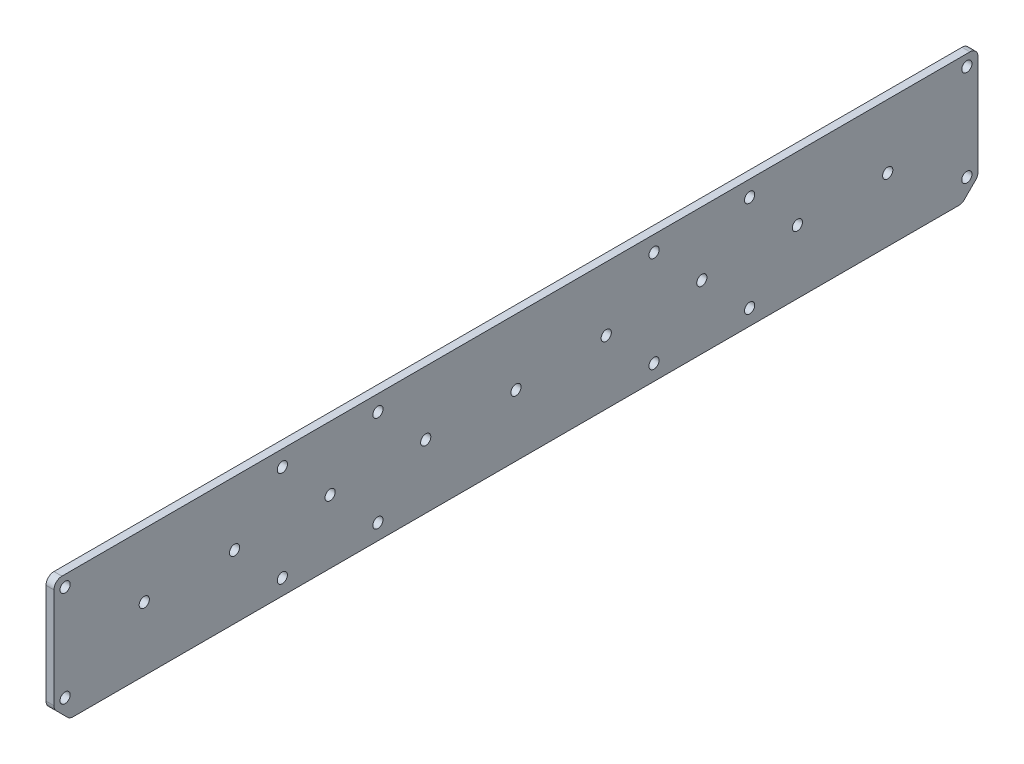
ISO-10303-21;
HEADER;
FILE_DESCRIPTION(('STEP AP214'),'2;1');
FILE_NAME('part.step','',(''),(''),'','','');
FILE_SCHEMA(('AUTOMOTIVE_DESIGN { 1 0 10303 214 1 1 1 1 }'));
ENDSEC;
DATA;
#1=APPLICATION_CONTEXT('core data for automotive mechanical design processes');
#2=APPLICATION_PROTOCOL_DEFINITION('international standard','automotive_design',2000,#1);
#3=PRODUCT_CONTEXT('',#1,'mechanical');
#4=PRODUCT('Part','Part','',(#3));
#5=PRODUCT_RELATED_PRODUCT_CATEGORY('part','',(#4));
#6=PRODUCT_DEFINITION_FORMATION('','',#4);
#7=PRODUCT_DEFINITION_CONTEXT('part definition',#1,'design');
#8=PRODUCT_DEFINITION('design','',#6,#7);
#9=PRODUCT_DEFINITION_SHAPE('','',#8);
#10=(LENGTH_UNIT() NAMED_UNIT(*) SI_UNIT(.MILLI.,.METRE.));
#11=(NAMED_UNIT(*) PLANE_ANGLE_UNIT() SI_UNIT($,.RADIAN.));
#12=(NAMED_UNIT(*) SI_UNIT($,.STERADIAN.) SOLID_ANGLE_UNIT());
#13=UNCERTAINTY_MEASURE_WITH_UNIT(LENGTH_MEASURE(1.E-05),#10,'distance_accuracy_value','');
#14=(GEOMETRIC_REPRESENTATION_CONTEXT(3) GLOBAL_UNCERTAINTY_ASSIGNED_CONTEXT((#13)) GLOBAL_UNIT_ASSIGNED_CONTEXT((#10,
#11,#12)) REPRESENTATION_CONTEXT('',''));
#15=CARTESIAN_POINT('',(0.,0.,0.));
#16=DIRECTION('',(0.,0.,1.));
#17=DIRECTION('',(1.,0.,0.));
#18=AXIS2_PLACEMENT_3D('',#15,#16,#17);
#19=CARTESIAN_POINT('',(3.175,0.,0.));
#20=DIRECTION('',(-1.,0.,0.));
#21=DIRECTION('',(0.,0.,1.));
#22=AXIS2_PLACEMENT_3D('',#19,#20,#21);
#23=PLANE('',#22);
#24=CARTESIAN_POINT('',(3.175,6.28396860616722,-91.0254223274925));
#25=DIRECTION('',(1.,0.,0.));
#26=DIRECTION('',(0.,0.,-1.));
#27=AXIS2_PLACEMENT_3D('',#24,#25,#26);
#28=CIRCLE('',#27,2.032);
#29=CARTESIAN_POINT('',(3.175,6.28396860616722,-93.0574223274924));
#30=VERTEX_POINT('',#29);
#31=EDGE_CURVE('E587',#30,#30,#28,.T.);
#32=ORIENTED_EDGE('',*,*,#31,.F.);
#33=EDGE_LOOP('',(#32));
#34=FACE_BOUND('',#33,.T.);
#35=CARTESIAN_POINT('',(3.175,44.5160313938328,-91.0254223274925));
#36=DIRECTION('',(1.,0.,0.));
#37=DIRECTION('',(0.,0.,-1.));
#38=AXIS2_PLACEMENT_3D('',#35,#36,#37);
#39=CIRCLE('',#38,2.032);
#40=CARTESIAN_POINT('',(3.175,44.5160313938328,-93.0574223274925));
#41=VERTEX_POINT('',#40);
#42=EDGE_CURVE('E590',#41,#41,#39,.T.);
#43=ORIENTED_EDGE('',*,*,#42,.F.);
#44=EDGE_LOOP('',(#43));
#45=FACE_BOUND('',#44,.T.);
#46=CARTESIAN_POINT('',(3.175,25.4,-71.9754223274925));
#47=DIRECTION('',(1.,0.,0.));
#48=DIRECTION('',(0.,0.,-1.));
#49=AXIS2_PLACEMENT_3D('',#46,#47,#48);
#50=CIRCLE('',#49,2.032);
#51=CARTESIAN_POINT('',(3.175,25.4,-74.0074223274925));
#52=VERTEX_POINT('',#51);
#53=EDGE_CURVE('E598',#52,#52,#50,.T.);
#54=ORIENTED_EDGE('',*,*,#53,.F.);
#55=EDGE_LOOP('',(#54));
#56=FACE_BOUND('',#55,.T.);
#57=CARTESIAN_POINT('',(3.175,25.4,-35.9920889941591));
#58=DIRECTION('',(1.,0.,0.));
#59=DIRECTION('',(0.,0.,-1.));
#60=AXIS2_PLACEMENT_3D('',#57,#58,#59);
#61=CIRCLE('',#60,2.032);
#62=CARTESIAN_POINT('',(3.175,25.4,-38.0240889941591));
#63=VERTEX_POINT('',#62);
#64=EDGE_CURVE('E605',#63,#63,#61,.T.);
#65=ORIENTED_EDGE('',*,*,#64,.F.);
#66=EDGE_LOOP('',(#65));
#67=FACE_BOUND('',#66,.T.);
#68=CARTESIAN_POINT('',(3.175,25.3999999999996,-148.175422327492));
#69=DIRECTION('',(1.,0.,0.));
#70=DIRECTION('',(0.,0.,-1.));
#71=AXIS2_PLACEMENT_3D('',#68,#69,#70);
#72=CIRCLE('',#71,2.032);
#73=CARTESIAN_POINT('',(3.175,25.3999999999996,-150.207422327492));
#74=VERTEX_POINT('',#73);
#75=EDGE_CURVE('E613',#74,#74,#72,.T.);
#76=ORIENTED_EDGE('',*,*,#75,.F.);
#77=EDGE_LOOP('',(#76));
#78=FACE_BOUND('',#77,.T.);
#79=CARTESIAN_POINT('',(3.175,6.28396860616722,-129.125422327492));
#80=DIRECTION('',(1.,0.,0.));
#81=DIRECTION('',(0.,0.,-1.));
#82=AXIS2_PLACEMENT_3D('',#79,#80,#81);
#83=CIRCLE('',#82,2.032);
#84=CARTESIAN_POINT('',(3.175,6.28396860616722,-131.157422327492));
#85=VERTEX_POINT('',#84);
#86=EDGE_CURVE('E621',#85,#85,#83,.T.);
#87=ORIENTED_EDGE('',*,*,#86,.F.);
#88=EDGE_LOOP('',(#87));
#89=FACE_BOUND('',#88,.T.);
#90=CARTESIAN_POINT('',(3.175,25.4,-110.075422327492));
#91=DIRECTION('',(1.,0.,0.));
#92=DIRECTION('',(0.,0.,-1.));
#93=AXIS2_PLACEMENT_3D('',#90,#91,#92);
#94=CIRCLE('',#93,2.032);
#95=CARTESIAN_POINT('',(3.175,25.4,-112.107422327492));
#96=VERTEX_POINT('',#95);
#97=EDGE_CURVE('E629',#96,#96,#94,.T.);
#98=ORIENTED_EDGE('',*,*,#97,.F.);
#99=EDGE_LOOP('',(#98));
#100=FACE_BOUND('',#99,.T.);
#101=CARTESIAN_POINT('',(3.175,44.5160313938328,-129.125422327492));
#102=DIRECTION('',(1.,0.,0.));
#103=DIRECTION('',(0.,0.,-1.));
#104=AXIS2_PLACEMENT_3D('',#101,#102,#103);
#105=CIRCLE('',#104,2.032);
#106=CARTESIAN_POINT('',(3.175,44.5160313938328,-131.157422327492));
#107=VERTEX_POINT('',#106);
#108=EDGE_CURVE('E637',#107,#107,#105,.T.);
#109=ORIENTED_EDGE('',*,*,#108,.F.);
#110=EDGE_LOOP('',(#109));
#111=FACE_BOUND('',#110,.T.);
#112=CARTESIAN_POINT('',(3.175,24.60625,-184.15));
#113=DIRECTION('',(1.,0.,0.));
#114=DIRECTION('',(0.,0.,-1.));
#115=AXIS2_PLACEMENT_3D('',#112,#113,#114);
#116=CIRCLE('',#115,2.032);
#117=CARTESIAN_POINT('',(3.175,24.60625,-186.182));
#118=VERTEX_POINT('',#117);
#119=EDGE_CURVE('E645',#118,#118,#116,.T.);
#120=ORIENTED_EDGE('',*,*,#119,.F.);
#121=EDGE_LOOP('',(#120));
#122=FACE_BOUND('',#121,.T.);
#123=CARTESIAN_POINT('',(3.175,25.4,-220.124577672508));
#124=DIRECTION('',(1.,0.,0.));
#125=DIRECTION('',(0.,0.,-1.));
#126=AXIS2_PLACEMENT_3D('',#123,#124,#125);
#127=CIRCLE('',#126,2.032);
#128=CARTESIAN_POINT('',(3.175,25.4,-222.156577672508));
#129=VERTEX_POINT('',#128);
#130=EDGE_CURVE('E653',#129,#129,#127,.T.);
#131=ORIENTED_EDGE('',*,*,#130,.F.);
#132=EDGE_LOOP('',(#131));
#133=FACE_BOUND('',#132,.T.);
#134=CARTESIAN_POINT('',(3.175,44.5160313938327,-239.174577672507));
#135=DIRECTION('',(1.,0.,0.));
#136=DIRECTION('',(0.,0.,-1.));
#137=AXIS2_PLACEMENT_3D('',#134,#135,#136);
#138=CIRCLE('',#137,2.032);
#139=CARTESIAN_POINT('',(3.175,44.5160313938327,-241.206577672508));
#140=VERTEX_POINT('',#139);
#141=EDGE_CURVE('E669',#140,#140,#138,.T.);
#142=ORIENTED_EDGE('',*,*,#141,.F.);
#143=EDGE_LOOP('',(#142));
#144=FACE_BOUND('',#143,.T.);
#145=CARTESIAN_POINT('',(3.175,25.4,-258.224577672508));
#146=DIRECTION('',(1.,0.,0.));
#147=DIRECTION('',(0.,0.,-1.));
#148=AXIS2_PLACEMENT_3D('',#145,#146,#147);
#149=CIRCLE('',#148,2.032);
#150=CARTESIAN_POINT('',(3.175,25.4,-260.256577672507));
#151=VERTEX_POINT('',#150);
#152=EDGE_CURVE('E677',#151,#151,#149,.T.);
#153=ORIENTED_EDGE('',*,*,#152,.F.);
#154=EDGE_LOOP('',(#153));
#155=FACE_BOUND('',#154,.T.);
#156=CARTESIAN_POINT('',(3.175,6.28396860616721,-277.274577672508));
#157=DIRECTION('',(1.,0.,0.));
#158=DIRECTION('',(0.,0.,-1.));
#159=AXIS2_PLACEMENT_3D('',#156,#157,#158);
#160=CIRCLE('',#159,2.032);
#161=CARTESIAN_POINT('',(3.175,6.28396860616721,-279.306577672508));
#162=VERTEX_POINT('',#161);
#163=EDGE_CURVE('E685',#162,#162,#160,.T.);
#164=ORIENTED_EDGE('',*,*,#163,.F.);
#165=EDGE_LOOP('',(#164));
#166=FACE_BOUND('',#165,.T.);
#167=CARTESIAN_POINT('',(3.175,44.5160313938327,-277.274577672508));
#168=DIRECTION('',(1.,0.,0.));
#169=DIRECTION('',(0.,0.,-1.));
#170=AXIS2_PLACEMENT_3D('',#167,#168,#169);
#171=CIRCLE('',#170,2.032);
#172=CARTESIAN_POINT('',(3.175,44.5160313938327,-279.306577672508));
#173=VERTEX_POINT('',#172);
#174=EDGE_CURVE('E693',#173,#173,#171,.T.);
#175=ORIENTED_EDGE('',*,*,#174,.F.);
#176=EDGE_LOOP('',(#175));
#177=FACE_BOUND('',#176,.T.);
#178=CARTESIAN_POINT('',(3.175,25.4,-296.324577672508));
#179=DIRECTION('',(1.,0.,0.));
#180=DIRECTION('',(0.,0.,-1.));
#181=AXIS2_PLACEMENT_3D('',#178,#179,#180);
#182=CIRCLE('',#181,2.032);
#183=CARTESIAN_POINT('',(3.175,25.4,-298.356577672508));
#184=VERTEX_POINT('',#183);
#185=EDGE_CURVE('E701',#184,#184,#182,.T.);
#186=ORIENTED_EDGE('',*,*,#185,.F.);
#187=EDGE_LOOP('',(#186));
#188=FACE_BOUND('',#187,.T.);
#189=CARTESIAN_POINT('',(3.175,25.4,-332.307911005841));
#190=DIRECTION('',(1.,0.,0.));
#191=DIRECTION('',(0.,0.,-1.));
#192=AXIS2_PLACEMENT_3D('',#189,#190,#191);
#193=CIRCLE('',#192,2.032);
#194=CARTESIAN_POINT('',(3.175,25.4,-334.339911005841));
#195=VERTEX_POINT('',#194);
#196=EDGE_CURVE('E709',#195,#195,#193,.T.);
#197=ORIENTED_EDGE('',*,*,#196,.F.);
#198=EDGE_LOOP('',(#197));
#199=FACE_BOUND('',#198,.T.);
#200=CARTESIAN_POINT('',(3.175,46.355,-363.855));
#201=DIRECTION('',(1.,0.,0.));
#202=DIRECTION('',(0.,0.,-1.));
#203=AXIS2_PLACEMENT_3D('',#200,#201,#202);
#204=CIRCLE('',#203,2.032);
#205=CARTESIAN_POINT('',(3.175,46.355,-365.887));
#206=VERTEX_POINT('',#205);
#207=EDGE_CURVE('E715',#206,#206,#204,.T.);
#208=ORIENTED_EDGE('',*,*,#207,.F.);
#209=EDGE_LOOP('',(#208));
#210=FACE_BOUND('',#209,.T.);
#211=CARTESIAN_POINT('',(3.175,46.355,-4.445));
#212=DIRECTION('',(1.,0.,0.));
#213=DIRECTION('',(0.,0.,-1.));
#214=AXIS2_PLACEMENT_3D('',#211,#212,#213);
#215=CIRCLE('',#214,2.032);
#216=CARTESIAN_POINT('',(3.175,46.355,-6.477));
#217=VERTEX_POINT('',#216);
#218=EDGE_CURVE('E721',#217,#217,#215,.T.);
#219=ORIENTED_EDGE('',*,*,#218,.F.);
#220=EDGE_LOOP('',(#219));
#221=FACE_BOUND('',#220,.T.);
#222=CARTESIAN_POINT('',(3.175,8.19117928474841,-4.445));
#223=DIRECTION('',(1.,0.,0.));
#224=DIRECTION('',(0.,0.,-1.));
#225=AXIS2_PLACEMENT_3D('',#222,#223,#224);
#226=CIRCLE('',#225,2.032);
#227=CARTESIAN_POINT('',(3.175,8.19117928474841,-6.477));
#228=VERTEX_POINT('',#227);
#229=EDGE_CURVE('E727',#228,#228,#226,.T.);
#230=ORIENTED_EDGE('',*,*,#229,.F.);
#231=EDGE_LOOP('',(#230));
#232=FACE_BOUND('',#231,.T.);
#233=CARTESIAN_POINT('',(3.175,8.1911792847484,-363.855));
#234=DIRECTION('',(1.,0.,0.));
#235=DIRECTION('',(0.,0.,-1.));
#236=AXIS2_PLACEMENT_3D('',#233,#234,#235);
#237=CIRCLE('',#236,2.032);
#238=CARTESIAN_POINT('',(3.175,8.1911792847484,-365.887));
#239=VERTEX_POINT('',#238);
#240=EDGE_CURVE('E734',#239,#239,#237,.T.);
#241=ORIENTED_EDGE('',*,*,#240,.F.);
#242=EDGE_LOOP('',(#241));
#243=FACE_BOUND('',#242,.T.);
#244=DIRECTION('',(0.,0.,-1.));
#245=VECTOR('',#244,1.);
#246=CARTESIAN_POINT('',(3.175,0.,0.));
#247=LINE('',#246,#245);
#248=CARTESIAN_POINT('',(3.175,0.,-7.66512806053454));
#249=VERTEX_POINT('',#248);
#250=CARTESIAN_POINT('',(3.175,0.,-360.634871939465));
#251=VERTEX_POINT('',#250);
#252=EDGE_CURVE('E164',#249,#251,#247,.T.);
#253=ORIENTED_EDGE('',*,*,#252,.T.);
#254=CARTESIAN_POINT('',(3.175,3.175,-360.634871939465));
#255=DIRECTION('',(-1.,0.,0.));
#256=DIRECTION('',(0.,0.,1.));
#257=AXIS2_PLACEMENT_3D('',#254,#255,#256);
#258=CIRCLE('',#257,3.175);
#259=CARTESIAN_POINT('',(3.175,0.929935969732726,-362.879935969733));
#260=VERTEX_POINT('',#259);
#261=EDGE_CURVE('E215',#251,#260,#258,.F.);
#262=ORIENTED_EDGE('',*,*,#261,.T.);
#263=DIRECTION('',(0.,-0.707106781186548,0.707106781186548));
#264=VECTOR('',#263,1.);
#265=CARTESIAN_POINT('',(3.175,6.34999999999997,-368.3));
#266=LINE('',#265,#264);
#267=CARTESIAN_POINT('',(3.175,5.42006403026729,-367.370064030267));
#268=VERTEX_POINT('',#267);
#269=EDGE_CURVE('E167',#260,#268,#266,.F.);
#270=ORIENTED_EDGE('',*,*,#269,.T.);
#271=CARTESIAN_POINT('',(3.175,7.66512806053458,-365.125));
#272=DIRECTION('',(-1.,0.,0.));
#273=DIRECTION('',(0.,0.,1.));
#274=AXIS2_PLACEMENT_3D('',#271,#272,#273);
#275=CIRCLE('',#274,3.175);
#276=CARTESIAN_POINT('',(3.175,7.66512806053458,-368.3));
#277=VERTEX_POINT('',#276);
#278=EDGE_CURVE('E213',#268,#277,#275,.F.);
#279=ORIENTED_EDGE('',*,*,#278,.T.);
#280=DIRECTION('',(0.,1.,0.));
#281=VECTOR('',#280,1.);
#282=CARTESIAN_POINT('',(3.175,0.,-368.3));
#283=LINE('',#282,#281);
#284=CARTESIAN_POINT('',(3.175,47.625,-368.3));
#285=VERTEX_POINT('',#284);
#286=EDGE_CURVE('E259',#277,#285,#283,.T.);
#287=ORIENTED_EDGE('',*,*,#286,.T.);
#288=CARTESIAN_POINT('',(3.175,47.625,-365.125));
#289=DIRECTION('',(-1.,0.,0.));
#290=DIRECTION('',(0.,0.,1.));
#291=AXIS2_PLACEMENT_3D('',#288,#289,#290);
#292=CIRCLE('',#291,3.175);
#293=CARTESIAN_POINT('',(3.175,50.8,-365.125));
#294=VERTEX_POINT('',#293);
#295=EDGE_CURVE('E211',#285,#294,#292,.F.);
#296=ORIENTED_EDGE('',*,*,#295,.T.);
#297=DIRECTION('',(0.,0.,1.));
#298=VECTOR('',#297,1.);
#299=CARTESIAN_POINT('',(3.175,50.8,0.));
#300=LINE('',#299,#298);
#301=CARTESIAN_POINT('',(3.175,50.8,-3.175));
#302=VERTEX_POINT('',#301);
#303=EDGE_CURVE('E194',#294,#302,#300,.T.);
#304=ORIENTED_EDGE('',*,*,#303,.T.);
#305=CARTESIAN_POINT('',(3.175,47.625,-3.175));
#306=DIRECTION('',(-1.,0.,0.));
#307=DIRECTION('',(0.,0.,1.));
#308=AXIS2_PLACEMENT_3D('',#305,#306,#307);
#309=CIRCLE('',#308,3.175);
#310=CARTESIAN_POINT('',(3.175,47.625,0.));
#311=VERTEX_POINT('',#310);
#312=EDGE_CURVE('E203',#302,#311,#309,.F.);
#313=ORIENTED_EDGE('',*,*,#312,.T.);
#314=DIRECTION('',(0.,-1.,0.));
#315=VECTOR('',#314,1.);
#316=CARTESIAN_POINT('',(3.175,0.,0.));
#317=LINE('',#316,#315);
#318=CARTESIAN_POINT('',(3.175,7.66512806053454,0.));
#319=VERTEX_POINT('',#318);
#320=EDGE_CURVE('E189',#311,#319,#317,.T.);
#321=ORIENTED_EDGE('',*,*,#320,.T.);
#322=CARTESIAN_POINT('',(3.175,7.66512806053454,-3.175));
#323=DIRECTION('',(-1.,0.,0.));
#324=DIRECTION('',(0.,0.,1.));
#325=AXIS2_PLACEMENT_3D('',#322,#323,#324);
#326=CIRCLE('',#325,3.175);
#327=CARTESIAN_POINT('',(3.175,5.42006403026726,-0.92993596973271));
#328=VERTEX_POINT('',#327);
#329=EDGE_CURVE('E205',#319,#328,#326,.F.);
#330=ORIENTED_EDGE('',*,*,#329,.T.);
#331=DIRECTION('',(0.,0.707106781186548,0.707106781186548));
#332=VECTOR('',#331,1.);
#333=CARTESIAN_POINT('',(3.175,0.,-6.34999999999997));
#334=LINE('',#333,#332);
#335=CARTESIAN_POINT('',(3.175,0.929935969732711,-5.42006403026726));
#336=VERTEX_POINT('',#335);
#337=EDGE_CURVE('E196',#328,#336,#334,.F.);
#338=ORIENTED_EDGE('',*,*,#337,.T.);
#339=CARTESIAN_POINT('',(3.175,3.175,-7.66512806053454));
#340=DIRECTION('',(-1.,0.,0.));
#341=DIRECTION('',(0.,0.,1.));
#342=AXIS2_PLACEMENT_3D('',#339,#340,#341);
#343=CIRCLE('',#342,3.175);
#344=EDGE_CURVE('E208',#336,#249,#343,.F.);
#345=ORIENTED_EDGE('',*,*,#344,.T.);
#346=EDGE_LOOP('',(#253,#262,#270,#279,#287,#296,#304,#313,#321,#330,#338,#345));
#347=FACE_BOUND('',#346,.T.);
#348=CARTESIAN_POINT('',(3.175,6.28396860616721,-239.174577672507));
#349=DIRECTION('',(1.,0.,0.));
#350=DIRECTION('',(0.,0.,-1.));
#351=AXIS2_PLACEMENT_3D('',#348,#349,#350);
#352=CIRCLE('',#351,2.032);
#353=CARTESIAN_POINT('',(3.175,6.28396860616721,-241.206577672508));
#354=VERTEX_POINT('',#353);
#355=EDGE_CURVE('E661',#354,#354,#352,.T.);
#356=ORIENTED_EDGE('',*,*,#355,.F.);
#357=EDGE_LOOP('',(#356));
#358=FACE_BOUND('',#357,.T.);
#359=ADVANCED_FACE('F47',(#34,#45,#56,#67,#78,#89,#100,#111,#122,#133,#144,#155,#166,#177,#188,
#199,#210,#221,#232,#243,#347,#358),#23,.F.);
#360=CARTESIAN_POINT('',(3.175,0.,0.));
#361=DIRECTION('',(0.,0.,-1.));
#362=DIRECTION('',(-1.,0.,0.));
#363=AXIS2_PLACEMENT_3D('',#360,#361,#362);
#364=PLANE('',#363);
#365=DIRECTION('',(0.,-1.,0.));
#366=VECTOR('',#365,1.);
#367=CARTESIAN_POINT('',(0.,0.,0.));
#368=LINE('',#367,#366);
#369=CARTESIAN_POINT('',(0.,47.625,0.));
#370=VERTEX_POINT('',#369);
#371=CARTESIAN_POINT('',(0.,7.66512806053454,0.));
#372=VERTEX_POINT('',#371);
#373=EDGE_CURVE('E175',#370,#372,#368,.T.);
#374=ORIENTED_EDGE('',*,*,#373,.T.);
#375=DIRECTION('',(-1.,0.,0.));
#376=VECTOR('',#375,1.);
#377=CARTESIAN_POINT('',(3.175,7.66512806053454,0.));
#378=LINE('',#377,#376);
#379=EDGE_CURVE('E11',#372,#319,#378,.F.);
#380=ORIENTED_EDGE('',*,*,#379,.T.);
#381=ORIENTED_EDGE('',*,*,#320,.F.);
#382=DIRECTION('',(-1.,0.,0.));
#383=VECTOR('',#382,1.);
#384=CARTESIAN_POINT('',(3.175,47.625,0.));
#385=LINE('',#384,#383);
#386=EDGE_CURVE('E55',#311,#370,#385,.T.);
#387=ORIENTED_EDGE('',*,*,#386,.T.);
#388=EDGE_LOOP('',(#374,#380,#381,#387));
#389=FACE_BOUND('',#388,.T.);
#390=ADVANCED_FACE('F245',(#389),#364,.F.);
#391=CARTESIAN_POINT('',(3.175,0.,0.));
#392=DIRECTION('',(0.,1.,0.));
#393=DIRECTION('',(0.,0.,1.));
#394=AXIS2_PLACEMENT_3D('',#391,#392,#393);
#395=PLANE('',#394);
#396=DIRECTION('',(0.,0.,-1.));
#397=VECTOR('',#396,1.);
#398=CARTESIAN_POINT('',(0.,0.,0.));
#399=LINE('',#398,#397);
#400=CARTESIAN_POINT('',(0.,0.,-7.66512806053454));
#401=VERTEX_POINT('',#400);
#402=CARTESIAN_POINT('',(0.,0.,-360.634871939465));
#403=VERTEX_POINT('',#402);
#404=EDGE_CURVE('E161',#401,#403,#399,.T.);
#405=ORIENTED_EDGE('',*,*,#404,.T.);
#406=DIRECTION('',(-1.,0.,0.));
#407=VECTOR('',#406,1.);
#408=CARTESIAN_POINT('',(3.175,0.,-360.634871939465));
#409=LINE('',#408,#407);
#410=EDGE_CURVE('E166',#403,#251,#409,.F.);
#411=ORIENTED_EDGE('',*,*,#410,.T.);
#412=ORIENTED_EDGE('',*,*,#252,.F.);
#413=DIRECTION('',(1.,0.,0.));
#414=VECTOR('',#413,1.);
#415=CARTESIAN_POINT('',(0.,0.,-7.66512806053454));
#416=LINE('',#415,#414);
#417=EDGE_CURVE('E148',#249,#401,#416,.F.);
#418=ORIENTED_EDGE('',*,*,#417,.T.);
#419=EDGE_LOOP('',(#405,#411,#412,#418));
#420=FACE_BOUND('',#419,.T.);
#421=ADVANCED_FACE('F159',(#420),#395,.F.);
#422=CARTESIAN_POINT('',(3.175,0.,-368.3));
#423=DIRECTION('',(0.,0.,1.));
#424=DIRECTION('',(1.,0.,0.));
#425=AXIS2_PLACEMENT_3D('',#422,#423,#424);
#426=PLANE('',#425);
#427=ORIENTED_EDGE('',*,*,#286,.F.);
#428=DIRECTION('',(1.,0.,0.));
#429=VECTOR('',#428,1.);
#430=CARTESIAN_POINT('',(0.,7.66512806053458,-368.3));
#431=LINE('',#430,#429);
#432=CARTESIAN_POINT('',(0.,7.66512806053458,-368.3));
#433=VERTEX_POINT('',#432);
#434=EDGE_CURVE('E230',#277,#433,#431,.F.);
#435=ORIENTED_EDGE('',*,*,#434,.T.);
#436=DIRECTION('',(0.,1.,0.));
#437=VECTOR('',#436,1.);
#438=CARTESIAN_POINT('',(0.,0.,-368.3));
#439=LINE('',#438,#437);
#440=CARTESIAN_POINT('',(0.,47.625,-368.3));
#441=VERTEX_POINT('',#440);
#442=EDGE_CURVE('E174',#433,#441,#439,.T.);
#443=ORIENTED_EDGE('',*,*,#442,.T.);
#444=DIRECTION('',(-1.,0.,0.));
#445=VECTOR('',#444,1.);
#446=CARTESIAN_POINT('',(3.175,47.625,-368.3));
#447=LINE('',#446,#445);
#448=EDGE_CURVE('E228',#441,#285,#447,.F.);
#449=ORIENTED_EDGE('',*,*,#448,.T.);
#450=EDGE_LOOP('',(#427,#435,#443,#449));
#451=FACE_BOUND('',#450,.T.);
#452=ADVANCED_FACE('F274',(#451),#426,.F.);
#453=CARTESIAN_POINT('',(3.175,50.8,0.));
#454=DIRECTION('',(0.,-1.,0.));
#455=DIRECTION('',(0.,0.,-1.));
#456=AXIS2_PLACEMENT_3D('',#453,#454,#455);
#457=PLANE('',#456);
#458=ORIENTED_EDGE('',*,*,#303,.F.);
#459=DIRECTION('',(-1.,0.,0.));
#460=VECTOR('',#459,1.);
#461=CARTESIAN_POINT('',(3.175,50.8,-365.125));
#462=LINE('',#461,#460);
#463=CARTESIAN_POINT('',(0.,50.8,-365.125));
#464=VERTEX_POINT('',#463);
#465=EDGE_CURVE('E235',#294,#464,#462,.T.);
#466=ORIENTED_EDGE('',*,*,#465,.T.);
#467=DIRECTION('',(0.,0.,1.));
#468=VECTOR('',#467,1.);
#469=CARTESIAN_POINT('',(0.,50.8,0.));
#470=LINE('',#469,#468);
#471=CARTESIAN_POINT('',(0.,50.8,-3.175));
#472=VERTEX_POINT('',#471);
#473=EDGE_CURVE('E180',#464,#472,#470,.T.);
#474=ORIENTED_EDGE('',*,*,#473,.T.);
#475=DIRECTION('',(-1.,0.,0.));
#476=VECTOR('',#475,1.);
#477=CARTESIAN_POINT('',(3.175,50.8,-3.175));
#478=LINE('',#477,#476);
#479=EDGE_CURVE('E233',#472,#302,#478,.F.);
#480=ORIENTED_EDGE('',*,*,#479,.T.);
#481=EDGE_LOOP('',(#458,#466,#474,#480));
#482=FACE_BOUND('',#481,.T.);
#483=ADVANCED_FACE('F270',(#482),#457,.F.);
#484=CARTESIAN_POINT('',(0.,0.,0.));
#485=DIRECTION('',(-1.,0.,0.));
#486=DIRECTION('',(0.,0.,1.));
#487=AXIS2_PLACEMENT_3D('',#484,#485,#486);
#488=PLANE('',#487);
#489=CARTESIAN_POINT('',(0.,6.28396860616722,-91.0254223274925));
#490=DIRECTION('',(1.,0.,0.));
#491=DIRECTION('',(0.,0.,-1.));
#492=AXIS2_PLACEMENT_3D('',#489,#490,#491);
#493=CIRCLE('',#492,2.032);
#494=CARTESIAN_POINT('',(0.,6.28396860616722,-93.0574223274924));
#495=VERTEX_POINT('',#494);
#496=EDGE_CURVE('E585',#495,#495,#493,.T.);
#497=ORIENTED_EDGE('',*,*,#496,.T.);
#498=EDGE_LOOP('',(#497));
#499=FACE_BOUND('',#498,.T.);
#500=CARTESIAN_POINT('',(0.,44.5160313938328,-91.0254223274925));
#501=DIRECTION('',(1.,0.,0.));
#502=DIRECTION('',(0.,0.,-1.));
#503=AXIS2_PLACEMENT_3D('',#500,#501,#502);
#504=CIRCLE('',#503,2.032);
#505=CARTESIAN_POINT('',(0.,44.5160313938328,-93.0574223274925));
#506=VERTEX_POINT('',#505);
#507=EDGE_CURVE('E595',#506,#506,#504,.T.);
#508=ORIENTED_EDGE('',*,*,#507,.T.);
#509=EDGE_LOOP('',(#508));
#510=FACE_BOUND('',#509,.T.);
#511=CARTESIAN_POINT('',(0.,25.4,-71.9754223274925));
#512=DIRECTION('',(1.,0.,0.));
#513=DIRECTION('',(0.,0.,-1.));
#514=AXIS2_PLACEMENT_3D('',#511,#512,#513);
#515=CIRCLE('',#514,2.032);
#516=CARTESIAN_POINT('',(0.,25.4,-74.0074223274925));
#517=VERTEX_POINT('',#516);
#518=EDGE_CURVE('E601',#517,#517,#515,.T.);
#519=ORIENTED_EDGE('',*,*,#518,.T.);
#520=EDGE_LOOP('',(#519));
#521=FACE_BOUND('',#520,.T.);
#522=CARTESIAN_POINT('',(0.,25.4,-35.9920889941591));
#523=DIRECTION('',(1.,0.,0.));
#524=DIRECTION('',(0.,0.,-1.));
#525=AXIS2_PLACEMENT_3D('',#522,#523,#524);
#526=CIRCLE('',#525,2.032);
#527=CARTESIAN_POINT('',(0.,25.4,-38.0240889941591));
#528=VERTEX_POINT('',#527);
#529=EDGE_CURVE('E609',#528,#528,#526,.T.);
#530=ORIENTED_EDGE('',*,*,#529,.T.);
#531=EDGE_LOOP('',(#530));
#532=FACE_BOUND('',#531,.T.);
#533=CARTESIAN_POINT('',(0.,25.3999999999996,-148.175422327492));
#534=DIRECTION('',(1.,0.,0.));
#535=DIRECTION('',(0.,0.,-1.));
#536=AXIS2_PLACEMENT_3D('',#533,#534,#535);
#537=CIRCLE('',#536,2.032);
#538=CARTESIAN_POINT('',(0.,25.3999999999996,-150.207422327492));
#539=VERTEX_POINT('',#538);
#540=EDGE_CURVE('E617',#539,#539,#537,.T.);
#541=ORIENTED_EDGE('',*,*,#540,.T.);
#542=EDGE_LOOP('',(#541));
#543=FACE_BOUND('',#542,.T.);
#544=CARTESIAN_POINT('',(0.,6.28396860616722,-129.125422327492));
#545=DIRECTION('',(1.,0.,0.));
#546=DIRECTION('',(0.,0.,-1.));
#547=AXIS2_PLACEMENT_3D('',#544,#545,#546);
#548=CIRCLE('',#547,2.032);
#549=CARTESIAN_POINT('',(0.,6.28396860616722,-131.157422327492));
#550=VERTEX_POINT('',#549);
#551=EDGE_CURVE('E625',#550,#550,#548,.T.);
#552=ORIENTED_EDGE('',*,*,#551,.T.);
#553=EDGE_LOOP('',(#552));
#554=FACE_BOUND('',#553,.T.);
#555=CARTESIAN_POINT('',(0.,25.4,-110.075422327492));
#556=DIRECTION('',(1.,0.,0.));
#557=DIRECTION('',(0.,0.,-1.));
#558=AXIS2_PLACEMENT_3D('',#555,#556,#557);
#559=CIRCLE('',#558,2.032);
#560=CARTESIAN_POINT('',(0.,25.4,-112.107422327492));
#561=VERTEX_POINT('',#560);
#562=EDGE_CURVE('E633',#561,#561,#559,.T.);
#563=ORIENTED_EDGE('',*,*,#562,.T.);
#564=EDGE_LOOP('',(#563));
#565=FACE_BOUND('',#564,.T.);
#566=CARTESIAN_POINT('',(0.,44.5160313938328,-129.125422327492));
#567=DIRECTION('',(1.,0.,0.));
#568=DIRECTION('',(0.,0.,-1.));
#569=AXIS2_PLACEMENT_3D('',#566,#567,#568);
#570=CIRCLE('',#569,2.032);
#571=CARTESIAN_POINT('',(0.,44.5160313938328,-131.157422327492));
#572=VERTEX_POINT('',#571);
#573=EDGE_CURVE('E641',#572,#572,#570,.T.);
#574=ORIENTED_EDGE('',*,*,#573,.T.);
#575=EDGE_LOOP('',(#574));
#576=FACE_BOUND('',#575,.T.);
#577=CARTESIAN_POINT('',(0.,24.60625,-184.15));
#578=DIRECTION('',(1.,0.,0.));
#579=DIRECTION('',(0.,0.,-1.));
#580=AXIS2_PLACEMENT_3D('',#577,#578,#579);
#581=CIRCLE('',#580,2.032);
#582=CARTESIAN_POINT('',(0.,24.60625,-186.182));
#583=VERTEX_POINT('',#582);
#584=EDGE_CURVE('E649',#583,#583,#581,.T.);
#585=ORIENTED_EDGE('',*,*,#584,.T.);
#586=EDGE_LOOP('',(#585));
#587=FACE_BOUND('',#586,.T.);
#588=CARTESIAN_POINT('',(0.,25.4,-220.124577672508));
#589=DIRECTION('',(1.,0.,0.));
#590=DIRECTION('',(0.,0.,-1.));
#591=AXIS2_PLACEMENT_3D('',#588,#589,#590);
#592=CIRCLE('',#591,2.032);
#593=CARTESIAN_POINT('',(0.,25.4,-222.156577672508));
#594=VERTEX_POINT('',#593);
#595=EDGE_CURVE('E657',#594,#594,#592,.T.);
#596=ORIENTED_EDGE('',*,*,#595,.T.);
#597=EDGE_LOOP('',(#596));
#598=FACE_BOUND('',#597,.T.);
#599=CARTESIAN_POINT('',(0.,6.28396860616721,-239.174577672507));
#600=DIRECTION('',(1.,0.,0.));
#601=DIRECTION('',(0.,0.,-1.));
#602=AXIS2_PLACEMENT_3D('',#599,#600,#601);
#603=CIRCLE('',#602,2.032);
#604=CARTESIAN_POINT('',(0.,6.28396860616721,-241.206577672508));
#605=VERTEX_POINT('',#604);
#606=EDGE_CURVE('E665',#605,#605,#603,.T.);
#607=ORIENTED_EDGE('',*,*,#606,.T.);
#608=EDGE_LOOP('',(#607));
#609=FACE_BOUND('',#608,.T.);
#610=CARTESIAN_POINT('',(0.,44.5160313938327,-239.174577672507));
#611=DIRECTION('',(1.,0.,0.));
#612=DIRECTION('',(0.,0.,-1.));
#613=AXIS2_PLACEMENT_3D('',#610,#611,#612);
#614=CIRCLE('',#613,2.032);
#615=CARTESIAN_POINT('',(0.,44.5160313938327,-241.206577672508));
#616=VERTEX_POINT('',#615);
#617=EDGE_CURVE('E673',#616,#616,#614,.T.);
#618=ORIENTED_EDGE('',*,*,#617,.T.);
#619=EDGE_LOOP('',(#618));
#620=FACE_BOUND('',#619,.T.);
#621=CARTESIAN_POINT('',(0.,25.4,-258.224577672508));
#622=DIRECTION('',(1.,0.,0.));
#623=DIRECTION('',(0.,0.,-1.));
#624=AXIS2_PLACEMENT_3D('',#621,#622,#623);
#625=CIRCLE('',#624,2.032);
#626=CARTESIAN_POINT('',(0.,25.4,-260.256577672507));
#627=VERTEX_POINT('',#626);
#628=EDGE_CURVE('E681',#627,#627,#625,.T.);
#629=ORIENTED_EDGE('',*,*,#628,.T.);
#630=EDGE_LOOP('',(#629));
#631=FACE_BOUND('',#630,.T.);
#632=CARTESIAN_POINT('',(0.,6.28396860616721,-277.274577672508));
#633=DIRECTION('',(1.,0.,0.));
#634=DIRECTION('',(0.,0.,-1.));
#635=AXIS2_PLACEMENT_3D('',#632,#633,#634);
#636=CIRCLE('',#635,2.032);
#637=CARTESIAN_POINT('',(0.,6.28396860616721,-279.306577672508));
#638=VERTEX_POINT('',#637);
#639=EDGE_CURVE('E689',#638,#638,#636,.T.);
#640=ORIENTED_EDGE('',*,*,#639,.T.);
#641=EDGE_LOOP('',(#640));
#642=FACE_BOUND('',#641,.T.);
#643=CARTESIAN_POINT('',(0.,44.5160313938327,-277.274577672508));
#644=DIRECTION('',(1.,0.,0.));
#645=DIRECTION('',(0.,0.,-1.));
#646=AXIS2_PLACEMENT_3D('',#643,#644,#645);
#647=CIRCLE('',#646,2.032);
#648=CARTESIAN_POINT('',(0.,44.5160313938327,-279.306577672508));
#649=VERTEX_POINT('',#648);
#650=EDGE_CURVE('E697',#649,#649,#647,.T.);
#651=ORIENTED_EDGE('',*,*,#650,.T.);
#652=EDGE_LOOP('',(#651));
#653=FACE_BOUND('',#652,.T.);
#654=CARTESIAN_POINT('',(0.,25.4,-296.324577672508));
#655=DIRECTION('',(1.,0.,0.));
#656=DIRECTION('',(0.,0.,-1.));
#657=AXIS2_PLACEMENT_3D('',#654,#655,#656);
#658=CIRCLE('',#657,2.032);
#659=CARTESIAN_POINT('',(0.,25.4,-298.356577672508));
#660=VERTEX_POINT('',#659);
#661=EDGE_CURVE('E705',#660,#660,#658,.T.);
#662=ORIENTED_EDGE('',*,*,#661,.T.);
#663=EDGE_LOOP('',(#662));
#664=FACE_BOUND('',#663,.T.);
#665=CARTESIAN_POINT('',(0.,25.4,-332.307911005841));
#666=DIRECTION('',(1.,0.,0.));
#667=DIRECTION('',(0.,0.,-1.));
#668=AXIS2_PLACEMENT_3D('',#665,#666,#667);
#669=CIRCLE('',#668,2.032);
#670=CARTESIAN_POINT('',(0.,25.4,-334.339911005841));
#671=VERTEX_POINT('',#670);
#672=EDGE_CURVE('E712',#671,#671,#669,.T.);
#673=ORIENTED_EDGE('',*,*,#672,.T.);
#674=EDGE_LOOP('',(#673));
#675=FACE_BOUND('',#674,.T.);
#676=CARTESIAN_POINT('',(0.,46.355,-363.855));
#677=DIRECTION('',(1.,0.,0.));
#678=DIRECTION('',(0.,0.,-1.));
#679=AXIS2_PLACEMENT_3D('',#676,#677,#678);
#680=CIRCLE('',#679,2.032);
#681=CARTESIAN_POINT('',(0.,46.355,-365.887));
#682=VERTEX_POINT('',#681);
#683=EDGE_CURVE('E718',#682,#682,#680,.T.);
#684=ORIENTED_EDGE('',*,*,#683,.T.);
#685=EDGE_LOOP('',(#684));
#686=FACE_BOUND('',#685,.T.);
#687=CARTESIAN_POINT('',(0.,46.355,-4.445));
#688=DIRECTION('',(1.,0.,0.));
#689=DIRECTION('',(0.,0.,-1.));
#690=AXIS2_PLACEMENT_3D('',#687,#688,#689);
#691=CIRCLE('',#690,2.032);
#692=CARTESIAN_POINT('',(0.,46.355,-6.477));
#693=VERTEX_POINT('',#692);
#694=EDGE_CURVE('E724',#693,#693,#691,.T.);
#695=ORIENTED_EDGE('',*,*,#694,.T.);
#696=EDGE_LOOP('',(#695));
#697=FACE_BOUND('',#696,.T.);
#698=CARTESIAN_POINT('',(0.,8.19117928474841,-4.445));
#699=DIRECTION('',(1.,0.,0.));
#700=DIRECTION('',(0.,0.,-1.));
#701=AXIS2_PLACEMENT_3D('',#698,#699,#700);
#702=CIRCLE('',#701,2.032);
#703=CARTESIAN_POINT('',(0.,8.19117928474841,-6.477));
#704=VERTEX_POINT('',#703);
#705=EDGE_CURVE('E731',#704,#704,#702,.T.);
#706=ORIENTED_EDGE('',*,*,#705,.T.);
#707=EDGE_LOOP('',(#706));
#708=FACE_BOUND('',#707,.T.);
#709=CARTESIAN_POINT('',(0.,8.1911792847484,-363.855));
#710=DIRECTION('',(1.,0.,0.));
#711=DIRECTION('',(0.,0.,-1.));
#712=AXIS2_PLACEMENT_3D('',#709,#710,#711);
#713=CIRCLE('',#712,2.032);
#714=CARTESIAN_POINT('',(0.,8.1911792847484,-365.887));
#715=VERTEX_POINT('',#714);
#716=EDGE_CURVE('E183',#715,#715,#713,.T.);
#717=ORIENTED_EDGE('',*,*,#716,.T.);
#718=EDGE_LOOP('',(#717));
#719=FACE_BOUND('',#718,.T.);
#720=DIRECTION('',(0.,0.707106781186548,-0.707106781186548));
#721=VECTOR('',#720,1.);
#722=CARTESIAN_POINT('',(0.,-180.975,-180.975));
#723=LINE('',#722,#721);
#724=CARTESIAN_POINT('',(0.,5.42006403026729,-367.370064030267));
#725=VERTEX_POINT('',#724);
#726=CARTESIAN_POINT('',(0.,0.929935969732759,-362.879935969733));
#727=VERTEX_POINT('',#726);
#728=EDGE_CURVE('E193',#725,#727,#723,.F.);
#729=ORIENTED_EDGE('',*,*,#728,.T.);
#730=CARTESIAN_POINT('',(0.,3.175,-360.634871939465));
#731=DIRECTION('',(-1.,0.,0.));
#732=DIRECTION('',(0.,0.,1.));
#733=AXIS2_PLACEMENT_3D('',#730,#731,#732);
#734=CIRCLE('',#733,3.175);
#735=EDGE_CURVE('E172',#727,#403,#734,.T.);
#736=ORIENTED_EDGE('',*,*,#735,.T.);
#737=ORIENTED_EDGE('',*,*,#404,.F.);
#738=CARTESIAN_POINT('',(0.,3.175,-7.66512806053454));
#739=DIRECTION('',(-1.,0.,0.));
#740=DIRECTION('',(0.,0.,1.));
#741=AXIS2_PLACEMENT_3D('',#738,#739,#740);
#742=CIRCLE('',#741,3.175);
#743=CARTESIAN_POINT('',(0.,0.92993596973271,-5.42006403026726));
#744=VERTEX_POINT('',#743);
#745=EDGE_CURVE('E144',#401,#744,#742,.T.);
#746=ORIENTED_EDGE('',*,*,#745,.T.);
#747=DIRECTION('',(0.,-0.707106781186548,-0.707106781186548));
#748=VECTOR('',#747,1.);
#749=CARTESIAN_POINT('',(0.,3.17499999999998,-3.17499999999998));
#750=LINE('',#749,#748);
#751=CARTESIAN_POINT('',(0.,5.42006403026726,-0.92993596973271));
#752=VERTEX_POINT('',#751);
#753=EDGE_CURVE('E190',#744,#752,#750,.F.);
#754=ORIENTED_EDGE('',*,*,#753,.T.);
#755=CARTESIAN_POINT('',(0.,7.66512806053454,-3.175));
#756=DIRECTION('',(-1.,0.,0.));
#757=DIRECTION('',(0.,0.,1.));
#758=AXIS2_PLACEMENT_3D('',#755,#756,#757);
#759=CIRCLE('',#758,3.175);
#760=EDGE_CURVE('E154',#752,#372,#759,.T.);
#761=ORIENTED_EDGE('',*,*,#760,.T.);
#762=ORIENTED_EDGE('',*,*,#373,.F.);
#763=CARTESIAN_POINT('',(0.,47.625,-3.175));
#764=DIRECTION('',(-1.,0.,0.));
#765=DIRECTION('',(0.,0.,1.));
#766=AXIS2_PLACEMENT_3D('',#763,#764,#765);
#767=CIRCLE('',#766,3.175);
#768=EDGE_CURVE('E62',#370,#472,#767,.T.);
#769=ORIENTED_EDGE('',*,*,#768,.T.);
#770=ORIENTED_EDGE('',*,*,#473,.F.);
#771=CARTESIAN_POINT('',(0.,47.625,-365.125));
#772=DIRECTION('',(-1.,0.,0.));
#773=DIRECTION('',(0.,0.,1.));
#774=AXIS2_PLACEMENT_3D('',#771,#772,#773);
#775=CIRCLE('',#774,3.175);
#776=EDGE_CURVE('E70',#464,#441,#775,.T.);
#777=ORIENTED_EDGE('',*,*,#776,.T.);
#778=ORIENTED_EDGE('',*,*,#442,.F.);
#779=CARTESIAN_POINT('',(0.,7.66512806053458,-365.125));
#780=DIRECTION('',(-1.,0.,0.));
#781=DIRECTION('',(0.,0.,1.));
#782=AXIS2_PLACEMENT_3D('',#779,#780,#781);
#783=CIRCLE('',#782,3.175);
#784=EDGE_CURVE('E225',#433,#725,#783,.T.);
#785=ORIENTED_EDGE('',*,*,#784,.T.);
#786=EDGE_LOOP('',(#729,#736,#737,#746,#754,#761,#762,#769,#770,#777,#778,#785));
#787=FACE_BOUND('',#786,.T.);
#788=ADVANCED_FACE('F170',(#499,#510,#521,#532,#543,#554,#565,#576,#587,#598,#609,#620,#631,
#642,#653,#664,#675,#686,#697,#708,#719,#787),#488,.T.);
#789=CARTESIAN_POINT('',(3.175,6.34999999999997,-368.3));
#790=DIRECTION('',(0.,0.707106781186548,0.707106781186548));
#791=DIRECTION('',(-1.,0.,0.));
#792=AXIS2_PLACEMENT_3D('',#789,#790,#791);
#793=PLANE('',#792);
#794=ORIENTED_EDGE('',*,*,#269,.F.);
#795=DIRECTION('',(1.,0.,0.));
#796=VECTOR('',#795,1.);
#797=CARTESIAN_POINT('',(0.,0.929935969732722,-362.879935969733));
#798=LINE('',#797,#796);
#799=EDGE_CURVE('E219',#260,#727,#798,.F.);
#800=ORIENTED_EDGE('',*,*,#799,.T.);
#801=ORIENTED_EDGE('',*,*,#728,.F.);
#802=DIRECTION('',(-1.,0.,0.));
#803=VECTOR('',#802,1.);
#804=CARTESIAN_POINT('',(3.175,5.42006403026729,-367.370064030267));
#805=LINE('',#804,#803);
#806=EDGE_CURVE('E217',#725,#268,#805,.F.);
#807=ORIENTED_EDGE('',*,*,#806,.T.);
#808=EDGE_LOOP('',(#794,#800,#801,#807));
#809=FACE_BOUND('',#808,.T.);
#810=ADVANCED_FACE('F302',(#809),#793,.F.);
#811=CARTESIAN_POINT('',(3.175,0.,-6.34999999999997));
#812=DIRECTION('',(0.,0.707106781186548,-0.707106781186548));
#813=DIRECTION('',(-1.,0.,0.));
#814=AXIS2_PLACEMENT_3D('',#811,#812,#813);
#815=PLANE('',#814);
#816=ORIENTED_EDGE('',*,*,#753,.F.);
#817=DIRECTION('',(-1.,0.,0.));
#818=VECTOR('',#817,1.);
#819=CARTESIAN_POINT('',(3.175,0.929935969732711,-5.42006403026726));
#820=LINE('',#819,#818);
#821=EDGE_CURVE('E149',#744,#336,#820,.F.);
#822=ORIENTED_EDGE('',*,*,#821,.T.);
#823=ORIENTED_EDGE('',*,*,#337,.F.);
#824=DIRECTION('',(1.,0.,0.));
#825=VECTOR('',#824,1.);
#826=CARTESIAN_POINT('',(0.,5.42006403026726,-0.929935969732711));
#827=LINE('',#826,#825);
#828=EDGE_CURVE('E237',#328,#752,#827,.F.);
#829=ORIENTED_EDGE('',*,*,#828,.T.);
#830=EDGE_LOOP('',(#816,#822,#823,#829));
#831=FACE_BOUND('',#830,.T.);
#832=ADVANCED_FACE('F316',(#831),#815,.F.);
#833=CARTESIAN_POINT('',(3.175,3.175,-360.634871939465));
#834=DIRECTION('',(1.,0.,0.));
#835=DIRECTION('',(0.,0.,-1.));
#836=AXIS2_PLACEMENT_3D('',#833,#834,#835);
#837=CYLINDRICAL_SURFACE('',#836,3.175);
#838=ORIENTED_EDGE('',*,*,#735,.F.);
#839=ORIENTED_EDGE('',*,*,#799,.F.);
#840=ORIENTED_EDGE('',*,*,#261,.F.);
#841=ORIENTED_EDGE('',*,*,#410,.F.);
#842=EDGE_LOOP('',(#838,#839,#840,#841));
#843=FACE_BOUND('',#842,.T.);
#844=ADVANCED_FACE('F285',(#843),#837,.T.);
#845=CARTESIAN_POINT('',(3.175,7.66512806053458,-365.125));
#846=DIRECTION('',(-1.,0.,0.));
#847=DIRECTION('',(0.,0.,1.));
#848=AXIS2_PLACEMENT_3D('',#845,#846,#847);
#849=CYLINDRICAL_SURFACE('',#848,3.175);
#850=ORIENTED_EDGE('',*,*,#278,.F.);
#851=ORIENTED_EDGE('',*,*,#806,.F.);
#852=ORIENTED_EDGE('',*,*,#784,.F.);
#853=ORIENTED_EDGE('',*,*,#434,.F.);
#854=EDGE_LOOP('',(#850,#851,#852,#853));
#855=FACE_BOUND('',#854,.T.);
#856=ADVANCED_FACE('F278',(#855),#849,.T.);
#857=CARTESIAN_POINT('',(3.175,47.625,-365.125));
#858=DIRECTION('',(-1.,0.,0.));
#859=DIRECTION('',(0.,0.,1.));
#860=AXIS2_PLACEMENT_3D('',#857,#858,#859);
#861=CYLINDRICAL_SURFACE('',#860,3.175);
#862=ORIENTED_EDGE('',*,*,#295,.F.);
#863=ORIENTED_EDGE('',*,*,#448,.F.);
#864=ORIENTED_EDGE('',*,*,#776,.F.);
#865=ORIENTED_EDGE('',*,*,#465,.F.);
#866=EDGE_LOOP('',(#862,#863,#864,#865));
#867=FACE_BOUND('',#866,.T.);
#868=ADVANCED_FACE('F276',(#867),#861,.T.);
#869=CARTESIAN_POINT('',(3.175,3.175,-7.66512806053454));
#870=DIRECTION('',(-1.,0.,0.));
#871=DIRECTION('',(0.,0.,1.));
#872=AXIS2_PLACEMENT_3D('',#869,#870,#871);
#873=CYLINDRICAL_SURFACE('',#872,3.175);
#874=ORIENTED_EDGE('',*,*,#344,.F.);
#875=ORIENTED_EDGE('',*,*,#821,.F.);
#876=ORIENTED_EDGE('',*,*,#745,.F.);
#877=ORIENTED_EDGE('',*,*,#417,.F.);
#878=EDGE_LOOP('',(#874,#875,#876,#877));
#879=FACE_BOUND('',#878,.T.);
#880=ADVANCED_FACE('F147',(#879),#873,.T.);
#881=CARTESIAN_POINT('',(3.175,7.66512806053454,-3.175));
#882=DIRECTION('',(1.,0.,0.));
#883=DIRECTION('',(0.,0.,-1.));
#884=AXIS2_PLACEMENT_3D('',#881,#882,#883);
#885=CYLINDRICAL_SURFACE('',#884,3.175);
#886=ORIENTED_EDGE('',*,*,#760,.F.);
#887=ORIENTED_EDGE('',*,*,#828,.F.);
#888=ORIENTED_EDGE('',*,*,#329,.F.);
#889=ORIENTED_EDGE('',*,*,#379,.F.);
#890=EDGE_LOOP('',(#886,#887,#888,#889));
#891=FACE_BOUND('',#890,.T.);
#892=ADVANCED_FACE('F253',(#891),#885,.T.);
#893=CARTESIAN_POINT('',(3.175,47.625,-3.175));
#894=DIRECTION('',(-1.,0.,0.));
#895=DIRECTION('',(0.,0.,1.));
#896=AXIS2_PLACEMENT_3D('',#893,#894,#895);
#897=CYLINDRICAL_SURFACE('',#896,3.175);
#898=ORIENTED_EDGE('',*,*,#312,.F.);
#899=ORIENTED_EDGE('',*,*,#479,.F.);
#900=ORIENTED_EDGE('',*,*,#768,.F.);
#901=ORIENTED_EDGE('',*,*,#386,.F.);
#902=EDGE_LOOP('',(#898,#899,#900,#901));
#903=FACE_BOUND('',#902,.T.);
#904=ADVANCED_FACE('F49',(#903),#897,.T.);
#905=CARTESIAN_POINT('',(3.175,8.1911792847484,-363.855));
#906=DIRECTION('',(1.,0.,0.));
#907=DIRECTION('',(0.,0.,-1.));
#908=AXIS2_PLACEMENT_3D('',#905,#906,#907);
#909=CYLINDRICAL_SURFACE('',#908,2.032);
#910=ORIENTED_EDGE('',*,*,#716,.F.);
#911=EDGE_LOOP('',(#910));
#912=FACE_BOUND('',#911,.T.);
#913=ORIENTED_EDGE('',*,*,#240,.T.);
#914=EDGE_LOOP('',(#913));
#915=FACE_BOUND('',#914,.T.);
#916=ADVANCED_FACE('F299',(#912,#915),#909,.F.);
#917=CARTESIAN_POINT('',(3.175,8.19117928474841,-4.445));
#918=DIRECTION('',(1.,0.,0.));
#919=DIRECTION('',(0.,0.,-1.));
#920=AXIS2_PLACEMENT_3D('',#917,#918,#919);
#921=CYLINDRICAL_SURFACE('',#920,2.032);
#922=ORIENTED_EDGE('',*,*,#705,.F.);
#923=EDGE_LOOP('',(#922));
#924=FACE_BOUND('',#923,.T.);
#925=ORIENTED_EDGE('',*,*,#229,.T.);
#926=EDGE_LOOP('',(#925));
#927=FACE_BOUND('',#926,.T.);
#928=ADVANCED_FACE('F378',(#924,#927),#921,.F.);
#929=CARTESIAN_POINT('',(3.175,46.355,-4.445));
#930=DIRECTION('',(1.,0.,0.));
#931=DIRECTION('',(0.,0.,-1.));
#932=AXIS2_PLACEMENT_3D('',#929,#930,#931);
#933=CYLINDRICAL_SURFACE('',#932,2.032);
#934=ORIENTED_EDGE('',*,*,#694,.F.);
#935=EDGE_LOOP('',(#934));
#936=FACE_BOUND('',#935,.T.);
#937=ORIENTED_EDGE('',*,*,#218,.T.);
#938=EDGE_LOOP('',(#937));
#939=FACE_BOUND('',#938,.T.);
#940=ADVANCED_FACE('F388',(#936,#939),#933,.F.);
#941=CARTESIAN_POINT('',(3.175,46.355,-363.855));
#942=DIRECTION('',(1.,0.,0.));
#943=DIRECTION('',(0.,0.,-1.));
#944=AXIS2_PLACEMENT_3D('',#941,#942,#943);
#945=CYLINDRICAL_SURFACE('',#944,2.032);
#946=ORIENTED_EDGE('',*,*,#683,.F.);
#947=EDGE_LOOP('',(#946));
#948=FACE_BOUND('',#947,.T.);
#949=ORIENTED_EDGE('',*,*,#207,.T.);
#950=EDGE_LOOP('',(#949));
#951=FACE_BOUND('',#950,.T.);
#952=ADVANCED_FACE('F397',(#948,#951),#945,.F.);
#953=CARTESIAN_POINT('',(3.175,25.4,-332.307911005841));
#954=DIRECTION('',(1.,0.,0.));
#955=DIRECTION('',(0.,0.,-1.));
#956=AXIS2_PLACEMENT_3D('',#953,#954,#955);
#957=CYLINDRICAL_SURFACE('',#956,2.032);
#958=ORIENTED_EDGE('',*,*,#672,.F.);
#959=EDGE_LOOP('',(#958));
#960=FACE_BOUND('',#959,.T.);
#961=ORIENTED_EDGE('',*,*,#196,.T.);
#962=EDGE_LOOP('',(#961));
#963=FACE_BOUND('',#962,.T.);
#964=ADVANCED_FACE('F407',(#960,#963),#957,.F.);
#965=CARTESIAN_POINT('',(3.175,25.4,-296.324577672508));
#966=DIRECTION('',(1.,0.,0.));
#967=DIRECTION('',(0.,0.,-1.));
#968=AXIS2_PLACEMENT_3D('',#965,#966,#967);
#969=CYLINDRICAL_SURFACE('',#968,2.032);
#970=ORIENTED_EDGE('',*,*,#661,.F.);
#971=EDGE_LOOP('',(#970));
#972=FACE_BOUND('',#971,.T.);
#973=ORIENTED_EDGE('',*,*,#185,.T.);
#974=EDGE_LOOP('',(#973));
#975=FACE_BOUND('',#974,.T.);
#976=ADVANCED_FACE('F417',(#972,#975),#969,.F.);
#977=CARTESIAN_POINT('',(3.175,44.5160313938327,-277.274577672508));
#978=DIRECTION('',(1.,0.,0.));
#979=DIRECTION('',(0.,0.,-1.));
#980=AXIS2_PLACEMENT_3D('',#977,#978,#979);
#981=CYLINDRICAL_SURFACE('',#980,2.032);
#982=ORIENTED_EDGE('',*,*,#650,.F.);
#983=EDGE_LOOP('',(#982));
#984=FACE_BOUND('',#983,.T.);
#985=ORIENTED_EDGE('',*,*,#174,.T.);
#986=EDGE_LOOP('',(#985));
#987=FACE_BOUND('',#986,.T.);
#988=ADVANCED_FACE('F427',(#984,#987),#981,.F.);
#989=CARTESIAN_POINT('',(3.175,6.28396860616721,-277.274577672508));
#990=DIRECTION('',(1.,0.,0.));
#991=DIRECTION('',(0.,0.,-1.));
#992=AXIS2_PLACEMENT_3D('',#989,#990,#991);
#993=CYLINDRICAL_SURFACE('',#992,2.032);
#994=ORIENTED_EDGE('',*,*,#639,.F.);
#995=EDGE_LOOP('',(#994));
#996=FACE_BOUND('',#995,.T.);
#997=ORIENTED_EDGE('',*,*,#163,.T.);
#998=EDGE_LOOP('',(#997));
#999=FACE_BOUND('',#998,.T.);
#1000=ADVANCED_FACE('F437',(#996,#999),#993,.F.);
#1001=CARTESIAN_POINT('',(3.175,25.4,-258.224577672508));
#1002=DIRECTION('',(1.,0.,0.));
#1003=DIRECTION('',(0.,0.,-1.));
#1004=AXIS2_PLACEMENT_3D('',#1001,#1002,#1003);
#1005=CYLINDRICAL_SURFACE('',#1004,2.032);
#1006=ORIENTED_EDGE('',*,*,#628,.F.);
#1007=EDGE_LOOP('',(#1006));
#1008=FACE_BOUND('',#1007,.T.);
#1009=ORIENTED_EDGE('',*,*,#152,.T.);
#1010=EDGE_LOOP('',(#1009));
#1011=FACE_BOUND('',#1010,.T.);
#1012=ADVANCED_FACE('F447',(#1008,#1011),#1005,.F.);
#1013=CARTESIAN_POINT('',(3.175,44.5160313938327,-239.174577672507));
#1014=DIRECTION('',(1.,0.,0.));
#1015=DIRECTION('',(0.,0.,-1.));
#1016=AXIS2_PLACEMENT_3D('',#1013,#1014,#1015);
#1017=CYLINDRICAL_SURFACE('',#1016,2.032);
#1018=ORIENTED_EDGE('',*,*,#617,.F.);
#1019=EDGE_LOOP('',(#1018));
#1020=FACE_BOUND('',#1019,.T.);
#1021=ORIENTED_EDGE('',*,*,#141,.T.);
#1022=EDGE_LOOP('',(#1021));
#1023=FACE_BOUND('',#1022,.T.);
#1024=ADVANCED_FACE('F457',(#1020,#1023),#1017,.F.);
#1025=CARTESIAN_POINT('',(3.175,6.28396860616721,-239.174577672507));
#1026=DIRECTION('',(1.,0.,0.));
#1027=DIRECTION('',(0.,0.,-1.));
#1028=AXIS2_PLACEMENT_3D('',#1025,#1026,#1027);
#1029=CYLINDRICAL_SURFACE('',#1028,2.032);
#1030=ORIENTED_EDGE('',*,*,#606,.F.);
#1031=EDGE_LOOP('',(#1030));
#1032=FACE_BOUND('',#1031,.T.);
#1033=ORIENTED_EDGE('',*,*,#355,.T.);
#1034=EDGE_LOOP('',(#1033));
#1035=FACE_BOUND('',#1034,.T.);
#1036=ADVANCED_FACE('F467',(#1032,#1035),#1029,.F.);
#1037=CARTESIAN_POINT('',(3.175,25.4,-220.124577672508));
#1038=DIRECTION('',(1.,0.,0.));
#1039=DIRECTION('',(0.,0.,-1.));
#1040=AXIS2_PLACEMENT_3D('',#1037,#1038,#1039);
#1041=CYLINDRICAL_SURFACE('',#1040,2.032);
#1042=ORIENTED_EDGE('',*,*,#595,.F.);
#1043=EDGE_LOOP('',(#1042));
#1044=FACE_BOUND('',#1043,.T.);
#1045=ORIENTED_EDGE('',*,*,#130,.T.);
#1046=EDGE_LOOP('',(#1045));
#1047=FACE_BOUND('',#1046,.T.);
#1048=ADVANCED_FACE('F477',(#1044,#1047),#1041,.F.);
#1049=CARTESIAN_POINT('',(3.175,24.60625,-184.15));
#1050=DIRECTION('',(1.,0.,0.));
#1051=DIRECTION('',(0.,0.,-1.));
#1052=AXIS2_PLACEMENT_3D('',#1049,#1050,#1051);
#1053=CYLINDRICAL_SURFACE('',#1052,2.032);
#1054=ORIENTED_EDGE('',*,*,#584,.F.);
#1055=EDGE_LOOP('',(#1054));
#1056=FACE_BOUND('',#1055,.T.);
#1057=ORIENTED_EDGE('',*,*,#119,.T.);
#1058=EDGE_LOOP('',(#1057));
#1059=FACE_BOUND('',#1058,.T.);
#1060=ADVANCED_FACE('F487',(#1056,#1059),#1053,.F.);
#1061=CARTESIAN_POINT('',(3.175,44.5160313938328,-129.125422327492));
#1062=DIRECTION('',(1.,0.,0.));
#1063=DIRECTION('',(0.,0.,-1.));
#1064=AXIS2_PLACEMENT_3D('',#1061,#1062,#1063);
#1065=CYLINDRICAL_SURFACE('',#1064,2.032);
#1066=ORIENTED_EDGE('',*,*,#573,.F.);
#1067=EDGE_LOOP('',(#1066));
#1068=FACE_BOUND('',#1067,.T.);
#1069=ORIENTED_EDGE('',*,*,#108,.T.);
#1070=EDGE_LOOP('',(#1069));
#1071=FACE_BOUND('',#1070,.T.);
#1072=ADVANCED_FACE('F497',(#1068,#1071),#1065,.F.);
#1073=CARTESIAN_POINT('',(3.175,25.4,-110.075422327492));
#1074=DIRECTION('',(1.,0.,0.));
#1075=DIRECTION('',(0.,0.,-1.));
#1076=AXIS2_PLACEMENT_3D('',#1073,#1074,#1075);
#1077=CYLINDRICAL_SURFACE('',#1076,2.032);
#1078=ORIENTED_EDGE('',*,*,#562,.F.);
#1079=EDGE_LOOP('',(#1078));
#1080=FACE_BOUND('',#1079,.T.);
#1081=ORIENTED_EDGE('',*,*,#97,.T.);
#1082=EDGE_LOOP('',(#1081));
#1083=FACE_BOUND('',#1082,.T.);
#1084=ADVANCED_FACE('F507',(#1080,#1083),#1077,.F.);
#1085=CARTESIAN_POINT('',(3.175,6.28396860616722,-129.125422327492));
#1086=DIRECTION('',(1.,0.,0.));
#1087=DIRECTION('',(0.,0.,-1.));
#1088=AXIS2_PLACEMENT_3D('',#1085,#1086,#1087);
#1089=CYLINDRICAL_SURFACE('',#1088,2.032);
#1090=ORIENTED_EDGE('',*,*,#551,.F.);
#1091=EDGE_LOOP('',(#1090));
#1092=FACE_BOUND('',#1091,.T.);
#1093=ORIENTED_EDGE('',*,*,#86,.T.);
#1094=EDGE_LOOP('',(#1093));
#1095=FACE_BOUND('',#1094,.T.);
#1096=ADVANCED_FACE('F517',(#1092,#1095),#1089,.F.);
#1097=CARTESIAN_POINT('',(3.175,25.3999999999996,-148.175422327492));
#1098=DIRECTION('',(1.,0.,0.));
#1099=DIRECTION('',(0.,0.,-1.));
#1100=AXIS2_PLACEMENT_3D('',#1097,#1098,#1099);
#1101=CYLINDRICAL_SURFACE('',#1100,2.032);
#1102=ORIENTED_EDGE('',*,*,#540,.F.);
#1103=EDGE_LOOP('',(#1102));
#1104=FACE_BOUND('',#1103,.T.);
#1105=ORIENTED_EDGE('',*,*,#75,.T.);
#1106=EDGE_LOOP('',(#1105));
#1107=FACE_BOUND('',#1106,.T.);
#1108=ADVANCED_FACE('F528',(#1104,#1107),#1101,.F.);
#1109=CARTESIAN_POINT('',(3.175,25.4,-35.9920889941591));
#1110=DIRECTION('',(1.,0.,0.));
#1111=DIRECTION('',(0.,0.,-1.));
#1112=AXIS2_PLACEMENT_3D('',#1109,#1110,#1111);
#1113=CYLINDRICAL_SURFACE('',#1112,2.032);
#1114=ORIENTED_EDGE('',*,*,#529,.F.);
#1115=EDGE_LOOP('',(#1114));
#1116=FACE_BOUND('',#1115,.T.);
#1117=ORIENTED_EDGE('',*,*,#64,.T.);
#1118=EDGE_LOOP('',(#1117));
#1119=FACE_BOUND('',#1118,.T.);
#1120=ADVANCED_FACE('F539',(#1116,#1119),#1113,.F.);
#1121=CARTESIAN_POINT('',(3.175,25.4,-71.9754223274925));
#1122=DIRECTION('',(1.,0.,0.));
#1123=DIRECTION('',(0.,0.,-1.));
#1124=AXIS2_PLACEMENT_3D('',#1121,#1122,#1123);
#1125=CYLINDRICAL_SURFACE('',#1124,2.032);
#1126=ORIENTED_EDGE('',*,*,#518,.F.);
#1127=EDGE_LOOP('',(#1126));
#1128=FACE_BOUND('',#1127,.T.);
#1129=ORIENTED_EDGE('',*,*,#53,.T.);
#1130=EDGE_LOOP('',(#1129));
#1131=FACE_BOUND('',#1130,.T.);
#1132=ADVANCED_FACE('F549',(#1128,#1131),#1125,.F.);
#1133=CARTESIAN_POINT('',(3.175,44.5160313938328,-91.0254223274925));
#1134=DIRECTION('',(1.,0.,0.));
#1135=DIRECTION('',(0.,0.,-1.));
#1136=AXIS2_PLACEMENT_3D('',#1133,#1134,#1135);
#1137=CYLINDRICAL_SURFACE('',#1136,2.032);
#1138=ORIENTED_EDGE('',*,*,#507,.F.);
#1139=EDGE_LOOP('',(#1138));
#1140=FACE_BOUND('',#1139,.T.);
#1141=ORIENTED_EDGE('',*,*,#42,.T.);
#1142=EDGE_LOOP('',(#1141));
#1143=FACE_BOUND('',#1142,.T.);
#1144=ADVANCED_FACE('F559',(#1140,#1143),#1137,.F.);
#1145=CARTESIAN_POINT('',(3.175,6.28396860616722,-91.0254223274925));
#1146=DIRECTION('',(1.,0.,0.));
#1147=DIRECTION('',(0.,0.,-1.));
#1148=AXIS2_PLACEMENT_3D('',#1145,#1146,#1147);
#1149=CYLINDRICAL_SURFACE('',#1148,2.032);
#1150=ORIENTED_EDGE('',*,*,#496,.F.);
#1151=EDGE_LOOP('',(#1150));
#1152=FACE_BOUND('',#1151,.T.);
#1153=ORIENTED_EDGE('',*,*,#31,.T.);
#1154=EDGE_LOOP('',(#1153));
#1155=FACE_BOUND('',#1154,.T.);
#1156=ADVANCED_FACE('F569',(#1152,#1155),#1149,.F.);
#1157=CLOSED_SHELL('',(#359,#390,#421,#452,#483,#788,#810,#832,#844,#856,#868,#880,#892,#904,
#916,#928,#940,#952,#964,#976,#988,#1000,#1012,#1024,#1036,#1048,#1060,#1072,#1084,#1096,#1108,
#1120,#1132,#1144,#1156));
#1158=MANIFOLD_SOLID_BREP('B2',#1157);
#1159=ADVANCED_BREP_SHAPE_REPRESENTATION('',(#18,#1158),#14);
#1160=SHAPE_DEFINITION_REPRESENTATION(#9,#1159);
ENDSEC;
END-ISO-10303-21;
